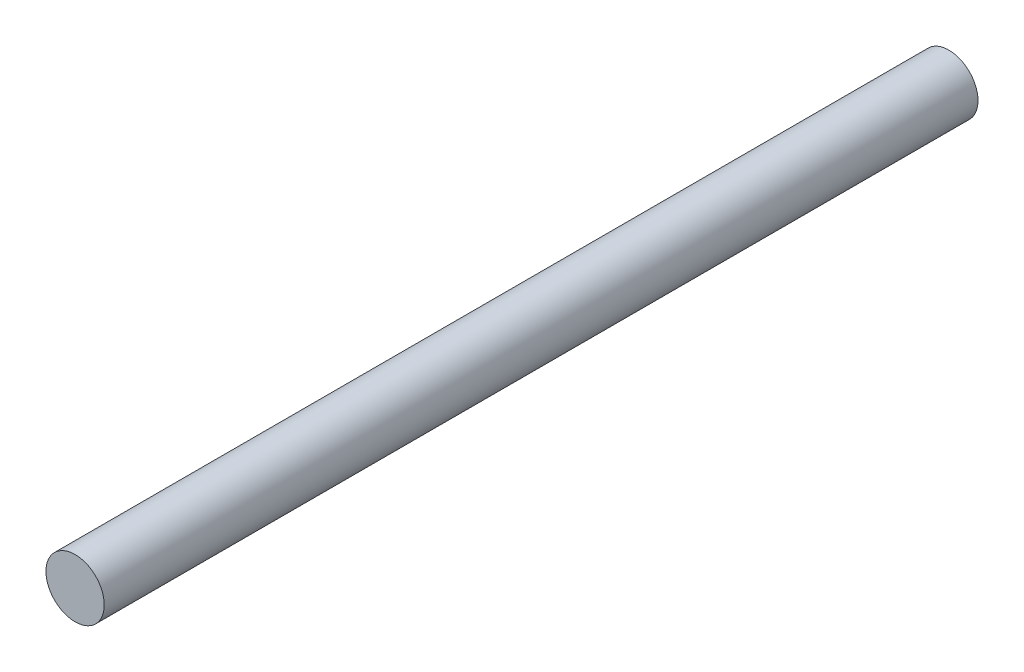
ISO-10303-21;
HEADER;
FILE_DESCRIPTION(('STEP AP214'),'2;1');
FILE_NAME('part.step','',(''),(''),'','','');
FILE_SCHEMA(('AUTOMOTIVE_DESIGN { 1 0 10303 214 1 1 1 1 }'));
ENDSEC;
DATA;
#1=APPLICATION_CONTEXT('core data for automotive mechanical design processes');
#2=APPLICATION_PROTOCOL_DEFINITION('international standard','automotive_design',2000,#1);
#3=PRODUCT_CONTEXT('',#1,'mechanical');
#4=PRODUCT('Part','Part','',(#3));
#5=PRODUCT_RELATED_PRODUCT_CATEGORY('part','',(#4));
#6=PRODUCT_DEFINITION_FORMATION('','',#4);
#7=PRODUCT_DEFINITION_CONTEXT('part definition',#1,'design');
#8=PRODUCT_DEFINITION('design','',#6,#7);
#9=PRODUCT_DEFINITION_SHAPE('','',#8);
#10=(LENGTH_UNIT() NAMED_UNIT(*) SI_UNIT(.MILLI.,.METRE.));
#11=(NAMED_UNIT(*) PLANE_ANGLE_UNIT() SI_UNIT($,.RADIAN.));
#12=(NAMED_UNIT(*) SI_UNIT($,.STERADIAN.) SOLID_ANGLE_UNIT());
#13=UNCERTAINTY_MEASURE_WITH_UNIT(LENGTH_MEASURE(1.E-05),#10,'distance_accuracy_value','');
#14=(GEOMETRIC_REPRESENTATION_CONTEXT(3) GLOBAL_UNCERTAINTY_ASSIGNED_CONTEXT((#13)) GLOBAL_UNIT_ASSIGNED_CONTEXT((#10,
#11,#12)) REPRESENTATION_CONTEXT('',''));
#15=CARTESIAN_POINT('',(0.,0.,0.));
#16=DIRECTION('',(0.,0.,1.));
#17=DIRECTION('',(1.,0.,0.));
#18=AXIS2_PLACEMENT_3D('',#15,#16,#17);
#19=CARTESIAN_POINT('',(0.,0.,-63.2));
#20=DIRECTION('',(0.,0.,1.));
#21=DIRECTION('',(1.,0.,0.));
#22=AXIS2_PLACEMENT_3D('',#19,#20,#21);
#23=CYLINDRICAL_SURFACE('',#22,8.89);
#24=CARTESIAN_POINT('',(0.,0.,-63.2));
#25=DIRECTION('',(0.,0.,1.));
#26=DIRECTION('',(1.,0.,0.));
#27=AXIS2_PLACEMENT_3D('',#24,#25,#26);
#28=CIRCLE('',#27,8.89);
#29=CARTESIAN_POINT('',(8.89,0.,-63.2));
#30=VERTEX_POINT('',#29);
#31=EDGE_CURVE('E10',#30,#30,#28,.T.);
#32=ORIENTED_EDGE('',*,*,#31,.T.);
#33=EDGE_LOOP('',(#32));
#34=FACE_BOUND('',#33,.T.);
#35=CARTESIAN_POINT('',(0.,0.,203.2));
#36=DIRECTION('',(0.,0.,1.));
#37=DIRECTION('',(1.,0.,0.));
#38=AXIS2_PLACEMENT_3D('',#35,#36,#37);
#39=CIRCLE('',#38,8.89);
#40=CARTESIAN_POINT('',(8.89,0.,203.2));
#41=VERTEX_POINT('',#40);
#42=EDGE_CURVE('E43',#41,#41,#39,.T.);
#43=ORIENTED_EDGE('',*,*,#42,.F.);
#44=EDGE_LOOP('',(#43));
#45=FACE_BOUND('',#44,.T.);
#46=ADVANCED_FACE('F37',(#34,#45),#23,.T.);
#47=CARTESIAN_POINT('',(0.,0.,-63.2));
#48=DIRECTION('',(0.,0.,1.));
#49=DIRECTION('',(1.,0.,0.));
#50=AXIS2_PLACEMENT_3D('',#47,#48,#49);
#51=PLANE('',#50);
#52=ORIENTED_EDGE('',*,*,#31,.F.);
#53=EDGE_LOOP('',(#52));
#54=FACE_BOUND('',#53,.T.);
#55=ADVANCED_FACE('F52',(#54),#51,.F.);
#56=CARTESIAN_POINT('',(0.,0.,203.2));
#57=DIRECTION('',(0.,0.,1.));
#58=DIRECTION('',(1.,0.,0.));
#59=AXIS2_PLACEMENT_3D('',#56,#57,#58);
#60=PLANE('',#59);
#61=ORIENTED_EDGE('',*,*,#42,.T.);
#62=EDGE_LOOP('',(#61));
#63=FACE_BOUND('',#62,.T.);
#64=ADVANCED_FACE('F49',(#63),#60,.T.);
#65=CLOSED_SHELL('',(#46,#55,#64));
#66=MANIFOLD_SOLID_BREP('B2',#65);
#67=ADVANCED_BREP_SHAPE_REPRESENTATION('',(#18,#66),#14);
#68=SHAPE_DEFINITION_REPRESENTATION(#9,#67);
ENDSEC;
END-ISO-10303-21;
